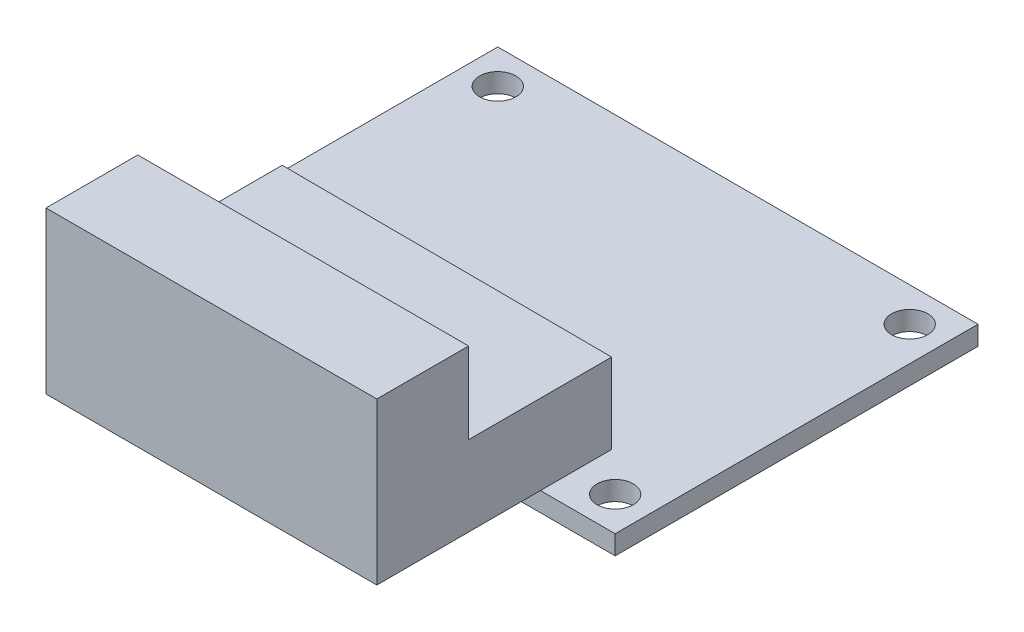
ISO-10303-21;
HEADER;
FILE_DESCRIPTION(('STEP AP214'),'2;1');
FILE_NAME('part.step','',(''),(''),'','','');
FILE_SCHEMA(('AUTOMOTIVE_DESIGN { 1 0 10303 214 1 1 1 1 }'));
ENDSEC;
DATA;
#1=APPLICATION_CONTEXT('core data for automotive mechanical design processes');
#2=APPLICATION_PROTOCOL_DEFINITION('international standard','automotive_design',2000,#1);
#3=PRODUCT_CONTEXT('',#1,'mechanical');
#4=PRODUCT('Part','Part','',(#3));
#5=PRODUCT_RELATED_PRODUCT_CATEGORY('part','',(#4));
#6=PRODUCT_DEFINITION_FORMATION('','',#4);
#7=PRODUCT_DEFINITION_CONTEXT('part definition',#1,'design');
#8=PRODUCT_DEFINITION('design','',#6,#7);
#9=PRODUCT_DEFINITION_SHAPE('','',#8);
#10=(LENGTH_UNIT() NAMED_UNIT(*) SI_UNIT(.MILLI.,.METRE.));
#11=(NAMED_UNIT(*) PLANE_ANGLE_UNIT() SI_UNIT($,.RADIAN.));
#12=(NAMED_UNIT(*) SI_UNIT($,.STERADIAN.) SOLID_ANGLE_UNIT());
#13=UNCERTAINTY_MEASURE_WITH_UNIT(LENGTH_MEASURE(1.E-05),#10,'distance_accuracy_value','');
#14=(GEOMETRIC_REPRESENTATION_CONTEXT(3) GLOBAL_UNCERTAINTY_ASSIGNED_CONTEXT((#13)) GLOBAL_UNIT_ASSIGNED_CONTEXT((#10,
#11,#12)) REPRESENTATION_CONTEXT('',''));
#15=CARTESIAN_POINT('',(0.,0.,0.));
#16=DIRECTION('',(0.,0.,1.));
#17=DIRECTION('',(1.,0.,0.));
#18=AXIS2_PLACEMENT_3D('',#15,#16,#17);
#19=CARTESIAN_POINT('',(0.,9.3,0.));
#20=DIRECTION('',(0.,-1.,0.));
#21=DIRECTION('',(0.,0.,-1.));
#22=AXIS2_PLACEMENT_3D('',#19,#20,#21);
#23=PLANE('',#22);
#24=DIRECTION('',(-1.,0.,0.));
#25=VECTOR('',#24,1.);
#26=CARTESIAN_POINT('',(-18.4694533762058,9.3,25.4931843437921));
#27=LINE('',#26,#25);
#28=CARTESIAN_POINT('',(12.5305466237942,9.3,25.4931843437921));
#29=VERTEX_POINT('',#28);
#30=CARTESIAN_POINT('',(-18.4694533762058,9.3,25.4931843437921));
#31=VERTEX_POINT('',#30);
#32=EDGE_CURVE('E49',#29,#31,#27,.T.);
#33=ORIENTED_EDGE('',*,*,#32,.F.);
#34=DIRECTION('',(0.,0.,-1.));
#35=VECTOR('',#34,1.);
#36=CARTESIAN_POINT('',(12.5305466237942,9.3,12.0931843437921));
#37=LINE('',#36,#35);
#38=CARTESIAN_POINT('',(12.5305466237942,9.3,12.0931843437921));
#39=VERTEX_POINT('',#38);
#40=EDGE_CURVE('E154',#29,#39,#37,.T.);
#41=ORIENTED_EDGE('',*,*,#40,.T.);
#42=DIRECTION('',(-0.999990944134189,0.,-0.00425577837923085));
#43=VECTOR('',#42,1.);
#44=CARTESIAN_POINT('',(-18.4694533762058,9.3,11.9612540192926));
#45=LINE('',#44,#43);
#46=CARTESIAN_POINT('',(-18.4694533762058,9.3,11.9612540192926));
#47=VERTEX_POINT('',#46);
#48=EDGE_CURVE('E156',#39,#47,#45,.T.);
#49=ORIENTED_EDGE('',*,*,#48,.T.);
#50=DIRECTION('',(0.,0.,1.));
#51=VECTOR('',#50,1.);
#52=CARTESIAN_POINT('',(-18.4694533762058,9.3,34.0931843437921));
#53=LINE('',#52,#51);
#54=EDGE_CURVE('E158',#47,#31,#53,.T.);
#55=ORIENTED_EDGE('',*,*,#54,.T.);
#56=EDGE_LOOP('',(#33,#41,#49,#55));
#57=FACE_BOUND('',#56,.T.);
#58=ADVANCED_FACE('F32',(#57),#23,.F.);
#59=CARTESIAN_POINT('',(-25.4694533762058,1.8,-15.2387459807074));
#60=DIRECTION('',(1.,0.,0.));
#61=DIRECTION('',(0.,0.,-1.));
#62=AXIS2_PLACEMENT_3D('',#59,#60,#61);
#63=PLANE('',#62);
#64=DIRECTION('',(0.,0.,1.));
#65=VECTOR('',#64,1.);
#66=CARTESIAN_POINT('',(-25.4694533762058,0.,-15.2387459807074));
#67=LINE('',#66,#65);
#68=CARTESIAN_POINT('',(-25.4694533762058,0.,-15.2387459807074));
#69=VERTEX_POINT('',#68);
#70=CARTESIAN_POINT('',(-25.4694533762058,0.,18.7612540192926));
#71=VERTEX_POINT('',#70);
#72=EDGE_CURVE('E193',#69,#71,#67,.T.);
#73=ORIENTED_EDGE('',*,*,#72,.T.);
#74=DIRECTION('',(0.,-1.,0.));
#75=VECTOR('',#74,1.);
#76=CARTESIAN_POINT('',(-25.4694533762058,1.8,18.7612540192926));
#77=LINE('',#76,#75);
#78=CARTESIAN_POINT('',(-25.4694533762058,1.8,18.7612540192926));
#79=VERTEX_POINT('',#78);
#80=EDGE_CURVE('E36',#79,#71,#77,.T.);
#81=ORIENTED_EDGE('',*,*,#80,.F.);
#82=DIRECTION('',(0.,0.,1.));
#83=VECTOR('',#82,1.);
#84=CARTESIAN_POINT('',(-25.4694533762058,1.8,-15.2387459807074));
#85=LINE('',#84,#83);
#86=CARTESIAN_POINT('',(-25.4694533762058,1.8,-15.2387459807074));
#87=VERTEX_POINT('',#86);
#88=EDGE_CURVE('E196',#87,#79,#85,.T.);
#89=ORIENTED_EDGE('',*,*,#88,.F.);
#90=DIRECTION('',(0.,-1.,0.));
#91=VECTOR('',#90,1.);
#92=CARTESIAN_POINT('',(-25.4694533762058,1.8,-15.2387459807074));
#93=LINE('',#92,#91);
#94=EDGE_CURVE('E208',#87,#69,#93,.T.);
#95=ORIENTED_EDGE('',*,*,#94,.T.);
#96=EDGE_LOOP('',(#73,#81,#89,#95));
#97=FACE_BOUND('',#96,.T.);
#98=ADVANCED_FACE('F34',(#97),#63,.F.);
#99=CARTESIAN_POINT('',(-25.4694533762058,1.8,18.7612540192926));
#100=DIRECTION('',(0.,0.,-1.));
#101=DIRECTION('',(-1.,0.,0.));
#102=AXIS2_PLACEMENT_3D('',#99,#100,#101);
#103=PLANE('',#102);
#104=DIRECTION('',(1.,0.,0.));
#105=VECTOR('',#104,1.);
#106=CARTESIAN_POINT('',(-25.4694533762058,0.,18.7612540192926));
#107=LINE('',#106,#105);
#108=CARTESIAN_POINT('',(19.5305466237942,0.,18.7612540192926));
#109=VERTEX_POINT('',#108);
#110=EDGE_CURVE('E211',#71,#109,#107,.T.);
#111=ORIENTED_EDGE('',*,*,#110,.T.);
#112=DIRECTION('',(0.,-1.,0.));
#113=VECTOR('',#112,1.);
#114=CARTESIAN_POINT('',(19.5305466237942,1.8,18.7612540192926));
#115=LINE('',#114,#113);
#116=CARTESIAN_POINT('',(19.5305466237942,1.8,18.7612540192926));
#117=VERTEX_POINT('',#116);
#118=EDGE_CURVE('E220',#117,#109,#115,.T.);
#119=ORIENTED_EDGE('',*,*,#118,.F.);
#120=DIRECTION('',(1.,0.,0.));
#121=VECTOR('',#120,1.);
#122=CARTESIAN_POINT('',(-25.4694533762058,1.8,18.7612540192926));
#123=LINE('',#122,#121);
#124=CARTESIAN_POINT('',(12.5305466237942,1.8,18.7612540192926));
#125=VERTEX_POINT('',#124);
#126=EDGE_CURVE('E199',#125,#117,#123,.T.);
#127=ORIENTED_EDGE('',*,*,#126,.F.);
#128=CARTESIAN_POINT('',(-18.4694533762058,1.8,18.7612540192926));
#129=VERTEX_POINT('',#128);
#130=EDGE_CURVE('E204',#129,#125,#123,.T.);
#131=ORIENTED_EDGE('',*,*,#130,.F.);
#132=EDGE_CURVE('E201',#79,#129,#123,.T.);
#133=ORIENTED_EDGE('',*,*,#132,.F.);
#134=ORIENTED_EDGE('',*,*,#80,.T.);
#135=EDGE_LOOP('',(#111,#119,#127,#131,#133,#134));
#136=FACE_BOUND('',#135,.T.);
#137=ADVANCED_FACE('F229',(#136),#103,.F.);
#138=CARTESIAN_POINT('',(19.5305466237942,1.8,-15.2387459807074));
#139=DIRECTION('',(-1.,0.,0.));
#140=DIRECTION('',(0.,0.,1.));
#141=AXIS2_PLACEMENT_3D('',#138,#139,#140);
#142=PLANE('',#141);
#143=DIRECTION('',(0.,0.,-1.));
#144=VECTOR('',#143,1.);
#145=CARTESIAN_POINT('',(19.5305466237942,0.,-15.2387459807074));
#146=LINE('',#145,#144);
#147=CARTESIAN_POINT('',(19.5305466237942,0.,-15.2387459807074));
#148=VERTEX_POINT('',#147);
#149=EDGE_CURVE('E213',#109,#148,#146,.T.);
#150=ORIENTED_EDGE('',*,*,#149,.T.);
#151=DIRECTION('',(0.,-1.,0.));
#152=VECTOR('',#151,1.);
#153=CARTESIAN_POINT('',(19.5305466237942,1.8,-15.2387459807074));
#154=LINE('',#153,#152);
#155=CARTESIAN_POINT('',(19.5305466237942,1.8,-15.2387459807074));
#156=VERTEX_POINT('',#155);
#157=EDGE_CURVE('E218',#156,#148,#154,.T.);
#158=ORIENTED_EDGE('',*,*,#157,.F.);
#159=DIRECTION('',(0.,0.,-1.));
#160=VECTOR('',#159,1.);
#161=CARTESIAN_POINT('',(19.5305466237942,1.8,-15.2387459807074));
#162=LINE('',#161,#160);
#163=EDGE_CURVE('E203',#117,#156,#162,.T.);
#164=ORIENTED_EDGE('',*,*,#163,.F.);
#165=ORIENTED_EDGE('',*,*,#118,.T.);
#166=EDGE_LOOP('',(#150,#158,#164,#165));
#167=FACE_BOUND('',#166,.T.);
#168=ADVANCED_FACE('F238',(#167),#142,.F.);
#169=CARTESIAN_POINT('',(-25.4694533762058,1.8,-15.2387459807074));
#170=DIRECTION('',(0.,0.,1.));
#171=DIRECTION('',(1.,0.,0.));
#172=AXIS2_PLACEMENT_3D('',#169,#170,#171);
#173=PLANE('',#172);
#174=DIRECTION('',(-1.,0.,0.));
#175=VECTOR('',#174,1.);
#176=CARTESIAN_POINT('',(-25.4694533762058,0.,-15.2387459807074));
#177=LINE('',#176,#175);
#178=EDGE_CURVE('E200',#148,#69,#177,.T.);
#179=ORIENTED_EDGE('',*,*,#178,.T.);
#180=ORIENTED_EDGE('',*,*,#94,.F.);
#181=DIRECTION('',(-1.,0.,0.));
#182=VECTOR('',#181,1.);
#183=CARTESIAN_POINT('',(-25.4694533762058,1.8,-15.2387459807074));
#184=LINE('',#183,#182);
#185=EDGE_CURVE('E206',#156,#87,#184,.T.);
#186=ORIENTED_EDGE('',*,*,#185,.F.);
#187=ORIENTED_EDGE('',*,*,#157,.T.);
#188=EDGE_LOOP('',(#179,#180,#186,#187));
#189=FACE_BOUND('',#188,.T.);
#190=ADVANCED_FACE('F241',(#189),#173,.F.);
#191=CARTESIAN_POINT('',(0.,1.8,0.));
#192=DIRECTION('',(0.,1.,0.));
#193=DIRECTION('',(0.,0.,1.));
#194=AXIS2_PLACEMENT_3D('',#191,#192,#193);
#195=PLANE('',#194);
#196=DIRECTION('',(0.,0.,1.));
#197=VECTOR('',#196,1.);
#198=CARTESIAN_POINT('',(-18.4694533762058,1.8,34.0931843437921));
#199=LINE('',#198,#197);
#200=CARTESIAN_POINT('',(-18.4694533762058,1.8,11.9612540192926));
#201=VERTEX_POINT('',#200);
#202=EDGE_CURVE('E57',#201,#129,#199,.T.);
#203=ORIENTED_EDGE('',*,*,#202,.F.);
#204=DIRECTION('',(-0.999990944134189,0.,-0.00425577837923085));
#205=VECTOR('',#204,1.);
#206=CARTESIAN_POINT('',(-18.4694533762058,1.8,11.9612540192926));
#207=LINE('',#206,#205);
#208=CARTESIAN_POINT('',(12.5305466237942,1.8,12.0931843437921));
#209=VERTEX_POINT('',#208);
#210=EDGE_CURVE('E162',#209,#201,#207,.T.);
#211=ORIENTED_EDGE('',*,*,#210,.F.);
#212=DIRECTION('',(0.,0.,-1.));
#213=VECTOR('',#212,1.);
#214=CARTESIAN_POINT('',(12.5305466237942,1.8,12.0931843437921));
#215=LINE('',#214,#213);
#216=EDGE_CURVE('E11',#125,#209,#215,.T.);
#217=ORIENTED_EDGE('',*,*,#216,.F.);
#218=ORIENTED_EDGE('',*,*,#126,.T.);
#219=ORIENTED_EDGE('',*,*,#163,.T.);
#220=ORIENTED_EDGE('',*,*,#185,.T.);
#221=ORIENTED_EDGE('',*,*,#88,.T.);
#222=ORIENTED_EDGE('',*,*,#132,.T.);
#223=EDGE_LOOP('',(#203,#211,#217,#218,#219,#220,#221,#222));
#224=FACE_BOUND('',#223,.T.);
#225=CARTESIAN_POINT('',(-22.2694533762058,1.8,-12.0387459807074));
#226=DIRECTION('',(0.,1.,0.));
#227=DIRECTION('',(0.,0.,-1.));
#228=AXIS2_PLACEMENT_3D('',#225,#226,#227);
#229=CIRCLE('',#228,1.7);
#230=CARTESIAN_POINT('',(-22.2694533762058,1.8,-13.7387459807074));
#231=VERTEX_POINT('',#230);
#232=EDGE_CURVE('E129',#231,#231,#229,.T.);
#233=ORIENTED_EDGE('',*,*,#232,.F.);
#234=EDGE_LOOP('',(#233));
#235=FACE_BOUND('',#234,.T.);
#236=CARTESIAN_POINT('',(16.3305466237942,1.8,-12.0387459807074));
#237=DIRECTION('',(0.,1.,0.));
#238=DIRECTION('',(0.,0.,1.));
#239=AXIS2_PLACEMENT_3D('',#236,#237,#238);
#240=CIRCLE('',#239,1.7);
#241=CARTESIAN_POINT('',(16.3305466237942,1.8,-10.3387459807074));
#242=VERTEX_POINT('',#241);
#243=EDGE_CURVE('E182',#242,#242,#240,.T.);
#244=ORIENTED_EDGE('',*,*,#243,.F.);
#245=EDGE_LOOP('',(#244));
#246=FACE_BOUND('',#245,.T.);
#247=CARTESIAN_POINT('',(16.3305466237942,1.8,15.5612540192926));
#248=DIRECTION('',(0.,1.,0.));
#249=DIRECTION('',(0.,0.,-1.));
#250=AXIS2_PLACEMENT_3D('',#247,#248,#249);
#251=CIRCLE('',#250,1.7);
#252=CARTESIAN_POINT('',(16.3305466237942,1.8,13.8612540192926));
#253=VERTEX_POINT('',#252);
#254=EDGE_CURVE('E176',#253,#253,#251,.T.);
#255=ORIENTED_EDGE('',*,*,#254,.F.);
#256=EDGE_LOOP('',(#255));
#257=FACE_BOUND('',#256,.T.);
#258=CARTESIAN_POINT('',(-22.2694533762058,1.8,15.5612540192926));
#259=DIRECTION('',(0.,1.,0.));
#260=DIRECTION('',(0.,0.,1.));
#261=AXIS2_PLACEMENT_3D('',#258,#259,#260);
#262=CIRCLE('',#261,1.7);
#263=CARTESIAN_POINT('',(-22.2694533762058,1.8,17.2612540192926));
#264=VERTEX_POINT('',#263);
#265=EDGE_CURVE('E175',#264,#264,#262,.T.);
#266=ORIENTED_EDGE('',*,*,#265,.F.);
#267=EDGE_LOOP('',(#266));
#268=FACE_BOUND('',#267,.T.);
#269=ADVANCED_FACE('F242',(#224,#235,#246,#257,#268),#195,.T.);
#270=CARTESIAN_POINT('',(0.,0.,0.));
#271=DIRECTION('',(0.,1.,0.));
#272=DIRECTION('',(0.,0.,1.));
#273=AXIS2_PLACEMENT_3D('',#270,#271,#272);
#274=PLANE('',#273);
#275=CARTESIAN_POINT('',(-22.2694533762058,0.,-12.0387459807074));
#276=DIRECTION('',(0.,1.,0.));
#277=DIRECTION('',(0.,0.,-1.));
#278=AXIS2_PLACEMENT_3D('',#275,#276,#277);
#279=CIRCLE('',#278,1.7);
#280=CARTESIAN_POINT('',(-22.2694533762058,0.,-13.7387459807074));
#281=VERTEX_POINT('',#280);
#282=EDGE_CURVE('E185',#281,#281,#279,.T.);
#283=ORIENTED_EDGE('',*,*,#282,.T.);
#284=EDGE_LOOP('',(#283));
#285=FACE_BOUND('',#284,.T.);
#286=CARTESIAN_POINT('',(16.3305466237942,0.,-12.0387459807074));
#287=DIRECTION('',(0.,1.,0.));
#288=DIRECTION('',(0.,0.,1.));
#289=AXIS2_PLACEMENT_3D('',#286,#287,#288);
#290=CIRCLE('',#289,1.7);
#291=CARTESIAN_POINT('',(16.3305466237942,0.,-10.3387459807074));
#292=VERTEX_POINT('',#291);
#293=EDGE_CURVE('E179',#292,#292,#290,.T.);
#294=ORIENTED_EDGE('',*,*,#293,.T.);
#295=EDGE_LOOP('',(#294));
#296=FACE_BOUND('',#295,.T.);
#297=CARTESIAN_POINT('',(16.3305466237942,0.,15.5612540192926));
#298=DIRECTION('',(0.,1.,0.));
#299=DIRECTION('',(0.,0.,-1.));
#300=AXIS2_PLACEMENT_3D('',#297,#298,#299);
#301=CIRCLE('',#300,1.7);
#302=CARTESIAN_POINT('',(16.3305466237942,0.,13.8612540192926));
#303=VERTEX_POINT('',#302);
#304=EDGE_CURVE('E172',#303,#303,#301,.T.);
#305=ORIENTED_EDGE('',*,*,#304,.T.);
#306=EDGE_LOOP('',(#305));
#307=FACE_BOUND('',#306,.T.);
#308=CARTESIAN_POINT('',(-22.2694533762058,0.,15.5612540192926));
#309=DIRECTION('',(0.,1.,0.));
#310=DIRECTION('',(0.,0.,1.));
#311=AXIS2_PLACEMENT_3D('',#308,#309,#310);
#312=CIRCLE('',#311,1.7);
#313=CARTESIAN_POINT('',(-22.2694533762058,0.,17.2612540192926));
#314=VERTEX_POINT('',#313);
#315=EDGE_CURVE('E190',#314,#314,#312,.T.);
#316=ORIENTED_EDGE('',*,*,#315,.T.);
#317=EDGE_LOOP('',(#316));
#318=FACE_BOUND('',#317,.T.);
#319=ORIENTED_EDGE('',*,*,#72,.F.);
#320=ORIENTED_EDGE('',*,*,#178,.F.);
#321=ORIENTED_EDGE('',*,*,#149,.F.);
#322=ORIENTED_EDGE('',*,*,#110,.F.);
#323=EDGE_LOOP('',(#319,#320,#321,#322));
#324=FACE_BOUND('',#323,.T.);
#325=ADVANCED_FACE('F236',(#285,#296,#307,#318,#324),#274,.F.);
#326=CARTESIAN_POINT('',(-22.2694533762058,0.,15.5612540192926));
#327=DIRECTION('',(0.,1.,0.));
#328=DIRECTION('',(0.,0.,1.));
#329=AXIS2_PLACEMENT_3D('',#326,#327,#328);
#330=CYLINDRICAL_SURFACE('',#329,1.7);
#331=ORIENTED_EDGE('',*,*,#315,.F.);
#332=EDGE_LOOP('',(#331));
#333=FACE_BOUND('',#332,.T.);
#334=ORIENTED_EDGE('',*,*,#265,.T.);
#335=EDGE_LOOP('',(#334));
#336=FACE_BOUND('',#335,.T.);
#337=ADVANCED_FACE('F360',(#333,#336),#330,.F.);
#338=CARTESIAN_POINT('',(16.3305466237942,0.,15.5612540192926));
#339=DIRECTION('',(0.,1.,0.));
#340=DIRECTION('',(0.,0.,1.));
#341=AXIS2_PLACEMENT_3D('',#338,#339,#340);
#342=CYLINDRICAL_SURFACE('',#341,1.7);
#343=ORIENTED_EDGE('',*,*,#304,.F.);
#344=EDGE_LOOP('',(#343));
#345=FACE_BOUND('',#344,.T.);
#346=ORIENTED_EDGE('',*,*,#254,.T.);
#347=EDGE_LOOP('',(#346));
#348=FACE_BOUND('',#347,.T.);
#349=ADVANCED_FACE('F351',(#345,#348),#342,.F.);
#350=CARTESIAN_POINT('',(16.3305466237942,0.,-12.0387459807074));
#351=DIRECTION('',(0.,1.,0.));
#352=DIRECTION('',(0.,0.,1.));
#353=AXIS2_PLACEMENT_3D('',#350,#351,#352);
#354=CYLINDRICAL_SURFACE('',#353,1.7);
#355=ORIENTED_EDGE('',*,*,#293,.F.);
#356=EDGE_LOOP('',(#355));
#357=FACE_BOUND('',#356,.T.);
#358=ORIENTED_EDGE('',*,*,#243,.T.);
#359=EDGE_LOOP('',(#358));
#360=FACE_BOUND('',#359,.T.);
#361=ADVANCED_FACE('F341',(#357,#360),#354,.F.);
#362=CARTESIAN_POINT('',(-22.2694533762058,0.,-12.0387459807074));
#363=DIRECTION('',(0.,1.,0.));
#364=DIRECTION('',(0.,0.,1.));
#365=AXIS2_PLACEMENT_3D('',#362,#363,#364);
#366=CYLINDRICAL_SURFACE('',#365,1.7);
#367=ORIENTED_EDGE('',*,*,#282,.F.);
#368=EDGE_LOOP('',(#367));
#369=FACE_BOUND('',#368,.T.);
#370=ORIENTED_EDGE('',*,*,#232,.T.);
#371=EDGE_LOOP('',(#370));
#372=FACE_BOUND('',#371,.T.);
#373=ADVANCED_FACE('F305',(#369,#372),#366,.F.);
#374=CARTESIAN_POINT('',(-18.4694533762058,9.3,34.0931843437921));
#375=DIRECTION('',(0.,0.,-1.));
#376=DIRECTION('',(-1.,0.,0.));
#377=AXIS2_PLACEMENT_3D('',#374,#375,#376);
#378=PLANE('',#377);
#379=DIRECTION('',(1.,0.,0.));
#380=VECTOR('',#379,1.);
#381=CARTESIAN_POINT('',(-18.4694533762058,1.8,34.0931843437921));
#382=LINE('',#381,#380);
#383=CARTESIAN_POINT('',(-18.4694533762058,1.8,34.0931843437921));
#384=VERTEX_POINT('',#383);
#385=CARTESIAN_POINT('',(12.5305466237942,1.8,34.0931843437921));
#386=VERTEX_POINT('',#385);
#387=EDGE_CURVE('E126',#384,#386,#382,.T.);
#388=ORIENTED_EDGE('',*,*,#387,.T.);
#389=DIRECTION('',(0.,-1.,0.));
#390=VECTOR('',#389,1.);
#391=CARTESIAN_POINT('',(12.5305466237942,9.3,34.0931843437921));
#392=LINE('',#391,#390);
#393=CARTESIAN_POINT('',(12.5305466237942,16.9,34.0931843437921));
#394=VERTEX_POINT('',#393);
#395=EDGE_CURVE('E119',#394,#386,#392,.T.);
#396=ORIENTED_EDGE('',*,*,#395,.F.);
#397=DIRECTION('',(1.,0.,0.));
#398=VECTOR('',#397,1.);
#399=CARTESIAN_POINT('',(12.5305466237942,16.9,34.0931843437921));
#400=LINE('',#399,#398);
#401=CARTESIAN_POINT('',(-18.4694533762058,16.9,34.0931843437921));
#402=VERTEX_POINT('',#401);
#403=EDGE_CURVE('E124',#402,#394,#400,.T.);
#404=ORIENTED_EDGE('',*,*,#403,.F.);
#405=DIRECTION('',(0.,-1.,0.));
#406=VECTOR('',#405,1.);
#407=CARTESIAN_POINT('',(-18.4694533762058,9.3,34.0931843437921));
#408=LINE('',#407,#406);
#409=EDGE_CURVE('E160',#402,#384,#408,.T.);
#410=ORIENTED_EDGE('',*,*,#409,.T.);
#411=EDGE_LOOP('',(#388,#396,#404,#410));
#412=FACE_BOUND('',#411,.T.);
#413=ADVANCED_FACE('F121',(#412),#378,.F.);
#414=CARTESIAN_POINT('',(12.5305466237942,9.3,12.0931843437921));
#415=DIRECTION('',(-1.,0.,0.));
#416=DIRECTION('',(0.,0.,1.));
#417=AXIS2_PLACEMENT_3D('',#414,#415,#416);
#418=PLANE('',#417);
#419=EDGE_CURVE('E42',#386,#125,#215,.T.);
#420=ORIENTED_EDGE('',*,*,#419,.T.);
#421=ORIENTED_EDGE('',*,*,#216,.T.);
#422=DIRECTION('',(0.,-1.,0.));
#423=VECTOR('',#422,1.);
#424=CARTESIAN_POINT('',(12.5305466237942,9.3,12.0931843437921));
#425=LINE('',#424,#423);
#426=EDGE_CURVE('E130',#39,#209,#425,.T.);
#427=ORIENTED_EDGE('',*,*,#426,.F.);
#428=ORIENTED_EDGE('',*,*,#40,.F.);
#429=DIRECTION('',(0.,-1.,0.));
#430=VECTOR('',#429,1.);
#431=CARTESIAN_POINT('',(12.5305466237942,16.9,25.4931843437921));
#432=LINE('',#431,#430);
#433=CARTESIAN_POINT('',(12.5305466237942,16.9,25.4931843437921));
#434=VERTEX_POINT('',#433);
#435=EDGE_CURVE('E136',#434,#29,#432,.T.);
#436=ORIENTED_EDGE('',*,*,#435,.F.);
#437=DIRECTION('',(0.,0.,-1.));
#438=VECTOR('',#437,1.);
#439=CARTESIAN_POINT('',(12.5305466237942,16.9,25.4931843437921));
#440=LINE('',#439,#438);
#441=EDGE_CURVE('E133',#394,#434,#440,.T.);
#442=ORIENTED_EDGE('',*,*,#441,.F.);
#443=ORIENTED_EDGE('',*,*,#395,.T.);
#444=EDGE_LOOP('',(#420,#421,#427,#428,#436,#442,#443));
#445=FACE_BOUND('',#444,.T.);
#446=ADVANCED_FACE('F134',(#445),#418,.F.);
#447=CARTESIAN_POINT('',(-18.4694533762058,9.3,11.9612540192926));
#448=DIRECTION('',(-0.00425577837923085,0.,0.999990944134189));
#449=DIRECTION('',(0.999990944134189,0.,0.00425577837923085));
#450=AXIS2_PLACEMENT_3D('',#447,#448,#449);
#451=PLANE('',#450);
#452=ORIENTED_EDGE('',*,*,#210,.T.);
#453=DIRECTION('',(0.,-1.,0.));
#454=VECTOR('',#453,1.);
#455=CARTESIAN_POINT('',(-18.4694533762058,9.3,11.9612540192926));
#456=LINE('',#455,#454);
#457=EDGE_CURVE('E167',#47,#201,#456,.T.);
#458=ORIENTED_EDGE('',*,*,#457,.F.);
#459=ORIENTED_EDGE('',*,*,#48,.F.);
#460=ORIENTED_EDGE('',*,*,#426,.T.);
#461=EDGE_LOOP('',(#452,#458,#459,#460));
#462=FACE_BOUND('',#461,.T.);
#463=ADVANCED_FACE('F252',(#462),#451,.F.);
#464=CARTESIAN_POINT('',(-18.4694533762058,9.3,34.0931843437921));
#465=DIRECTION('',(1.,0.,0.));
#466=DIRECTION('',(0.,0.,-1.));
#467=AXIS2_PLACEMENT_3D('',#464,#465,#466);
#468=PLANE('',#467);
#469=ORIENTED_EDGE('',*,*,#202,.T.);
#470=EDGE_CURVE('E164',#129,#384,#199,.T.);
#471=ORIENTED_EDGE('',*,*,#470,.T.);
#472=ORIENTED_EDGE('',*,*,#409,.F.);
#473=DIRECTION('',(0.,0.,1.));
#474=VECTOR('',#473,1.);
#475=CARTESIAN_POINT('',(-18.4694533762058,16.9,34.0931843437921));
#476=LINE('',#475,#474);
#477=CARTESIAN_POINT('',(-18.4694533762058,16.9,25.4931843437921));
#478=VERTEX_POINT('',#477);
#479=EDGE_CURVE('E144',#478,#402,#476,.T.);
#480=ORIENTED_EDGE('',*,*,#479,.F.);
#481=DIRECTION('',(0.,-1.,0.));
#482=VECTOR('',#481,1.);
#483=CARTESIAN_POINT('',(-18.4694533762058,16.9,25.4931843437921));
#484=LINE('',#483,#482);
#485=EDGE_CURVE('E149',#478,#31,#484,.T.);
#486=ORIENTED_EDGE('',*,*,#485,.T.);
#487=ORIENTED_EDGE('',*,*,#54,.F.);
#488=ORIENTED_EDGE('',*,*,#457,.T.);
#489=EDGE_LOOP('',(#469,#471,#472,#480,#486,#487,#488));
#490=FACE_BOUND('',#489,.T.);
#491=ADVANCED_FACE('F259',(#490),#468,.F.);
#492=CARTESIAN_POINT('',(0.,1.8,0.));
#493=DIRECTION('',(0.,-1.,0.));
#494=DIRECTION('',(0.,0.,-1.));
#495=AXIS2_PLACEMENT_3D('',#492,#493,#494);
#496=PLANE('',#495);
#497=ORIENTED_EDGE('',*,*,#470,.F.);
#498=ORIENTED_EDGE('',*,*,#130,.T.);
#499=ORIENTED_EDGE('',*,*,#419,.F.);
#500=ORIENTED_EDGE('',*,*,#387,.F.);
#501=EDGE_LOOP('',(#497,#498,#499,#500));
#502=FACE_BOUND('',#501,.T.);
#503=ADVANCED_FACE('F248',(#502),#496,.T.);
#504=CARTESIAN_POINT('',(-18.4694533762058,16.9,25.4931843437921));
#505=DIRECTION('',(0.,0.,1.));
#506=DIRECTION('',(1.,0.,0.));
#507=AXIS2_PLACEMENT_3D('',#504,#505,#506);
#508=PLANE('',#507);
#509=ORIENTED_EDGE('',*,*,#32,.T.);
#510=ORIENTED_EDGE('',*,*,#485,.F.);
#511=DIRECTION('',(-1.,0.,0.));
#512=VECTOR('',#511,1.);
#513=CARTESIAN_POINT('',(-18.4694533762058,16.9,25.4931843437921));
#514=LINE('',#513,#512);
#515=EDGE_CURVE('E139',#434,#478,#514,.T.);
#516=ORIENTED_EDGE('',*,*,#515,.F.);
#517=ORIENTED_EDGE('',*,*,#435,.T.);
#518=EDGE_LOOP('',(#509,#510,#516,#517));
#519=FACE_BOUND('',#518,.T.);
#520=ADVANCED_FACE('F256',(#519),#508,.F.);
#521=CARTESIAN_POINT('',(0.,16.9,0.));
#522=DIRECTION('',(0.,-1.,0.));
#523=DIRECTION('',(0.,0.,-1.));
#524=AXIS2_PLACEMENT_3D('',#521,#522,#523);
#525=PLANE('',#524);
#526=ORIENTED_EDGE('',*,*,#403,.T.);
#527=ORIENTED_EDGE('',*,*,#441,.T.);
#528=ORIENTED_EDGE('',*,*,#515,.T.);
#529=ORIENTED_EDGE('',*,*,#479,.T.);
#530=EDGE_LOOP('',(#526,#527,#528,#529));
#531=FACE_BOUND('',#530,.T.);
#532=ADVANCED_FACE('F142',(#531),#525,.F.);
#533=CLOSED_SHELL('',(#58,#98,#137,#168,#190,#269,#325,#337,#349,#361,#373,#413,#446,#463,#491,
#503,#520,#532));
#534=MANIFOLD_SOLID_BREP('B2',#533);
#535=ADVANCED_BREP_SHAPE_REPRESENTATION('',(#18,#534),#14);
#536=SHAPE_DEFINITION_REPRESENTATION(#9,#535);
ENDSEC;
END-ISO-10303-21;
